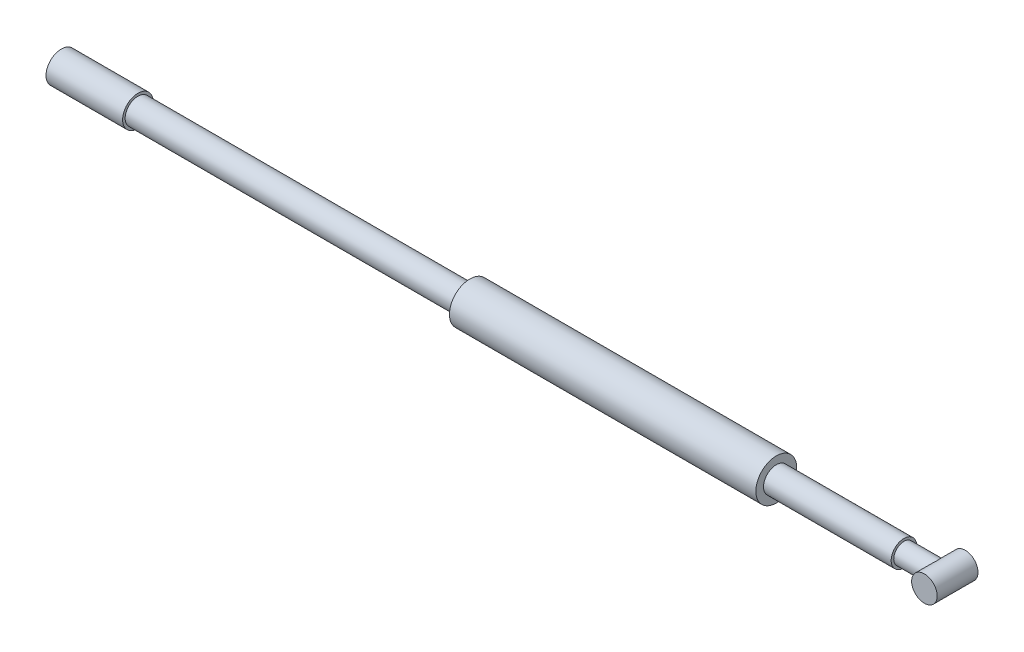
ISO-10303-21;
HEADER;
FILE_DESCRIPTION(('STEP AP214'),'2;1');
FILE_NAME('part.step','',(''),(''),'','','');
FILE_SCHEMA(('AUTOMOTIVE_DESIGN { 1 0 10303 214 1 1 1 1 }'));
ENDSEC;
DATA;
#1=APPLICATION_CONTEXT('core data for automotive mechanical design processes');
#2=APPLICATION_PROTOCOL_DEFINITION('international standard','automotive_design',2000,#1);
#3=PRODUCT_CONTEXT('',#1,'mechanical');
#4=PRODUCT('Part','Part','',(#3));
#5=PRODUCT_RELATED_PRODUCT_CATEGORY('part','',(#4));
#6=PRODUCT_DEFINITION_FORMATION('','',#4);
#7=PRODUCT_DEFINITION_CONTEXT('part definition',#1,'design');
#8=PRODUCT_DEFINITION('design','',#6,#7);
#9=PRODUCT_DEFINITION_SHAPE('','',#8);
#10=(LENGTH_UNIT() NAMED_UNIT(*) SI_UNIT(.MILLI.,.METRE.));
#11=(NAMED_UNIT(*) PLANE_ANGLE_UNIT() SI_UNIT($,.RADIAN.));
#12=(NAMED_UNIT(*) SI_UNIT($,.STERADIAN.) SOLID_ANGLE_UNIT());
#13=UNCERTAINTY_MEASURE_WITH_UNIT(LENGTH_MEASURE(1.E-05),#10,'distance_accuracy_value','');
#14=(GEOMETRIC_REPRESENTATION_CONTEXT(3) GLOBAL_UNCERTAINTY_ASSIGNED_CONTEXT((#13)) GLOBAL_UNIT_ASSIGNED_CONTEXT((#10,
#11,#12)) REPRESENTATION_CONTEXT('',''));
#15=CARTESIAN_POINT('',(0.,0.,0.));
#16=DIRECTION('',(0.,0.,1.));
#17=DIRECTION('',(1.,0.,0.));
#18=AXIS2_PLACEMENT_3D('',#15,#16,#17);
#19=CARTESIAN_POINT('',(150.,0.,0.));
#20=DIRECTION('',(1.,0.,0.));
#21=DIRECTION('',(0.,0.,-1.));
#22=AXIS2_PLACEMENT_3D('',#19,#20,#21);
#23=PLANE('',#22);
#24=CARTESIAN_POINT('',(150.,0.,0.));
#25=DIRECTION('',(1.,0.,0.));
#26=DIRECTION('',(0.,0.,-1.));
#27=AXIS2_PLACEMENT_3D('',#24,#25,#26);
#28=CIRCLE('',#27,2.5);
#29=CARTESIAN_POINT('',(150.,0.,-2.5));
#30=VERTEX_POINT('',#29);
#31=EDGE_CURVE('E40',#30,#30,#28,.T.);
#32=ORIENTED_EDGE('',*,*,#31,.T.);
#33=EDGE_LOOP('',(#32));
#34=FACE_BOUND('',#33,.T.);
#35=CARTESIAN_POINT('',(150.,0.,0.));
#36=DIRECTION('',(1.,0.,0.));
#37=DIRECTION('',(0.,0.,-1.));
#38=AXIS2_PLACEMENT_3D('',#35,#36,#37);
#39=CIRCLE('',#38,2.);
#40=CARTESIAN_POINT('',(150.,0.,-2.));
#41=VERTEX_POINT('',#40);
#42=EDGE_CURVE('E59',#41,#41,#39,.T.);
#43=ORIENTED_EDGE('',*,*,#42,.F.);
#44=EDGE_LOOP('',(#43));
#45=FACE_BOUND('',#44,.T.);
#46=ADVANCED_FACE('F33',(#34,#45),#23,.T.);
#47=CARTESIAN_POINT('',(150.,0.,0.));
#48=DIRECTION('',(-1.,0.,0.));
#49=DIRECTION('',(0.,0.,1.));
#50=AXIS2_PLACEMENT_3D('',#47,#48,#49);
#51=CYLINDRICAL_SURFACE('',#50,2.5);
#52=CARTESIAN_POINT('',(125.,0.,0.));
#53=DIRECTION('',(1.,0.,0.));
#54=DIRECTION('',(0.,0.,-1.));
#55=AXIS2_PLACEMENT_3D('',#52,#53,#54);
#56=CIRCLE('',#55,2.5);
#57=CARTESIAN_POINT('',(125.,0.,-2.5));
#58=VERTEX_POINT('',#57);
#59=EDGE_CURVE('E61',#58,#58,#56,.T.);
#60=ORIENTED_EDGE('',*,*,#59,.T.);
#61=EDGE_LOOP('',(#60));
#62=FACE_BOUND('',#61,.T.);
#63=ORIENTED_EDGE('',*,*,#31,.F.);
#64=EDGE_LOOP('',(#63));
#65=FACE_BOUND('',#64,.T.);
#66=ADVANCED_FACE('F35',(#62,#65),#51,.T.);
#67=CARTESIAN_POINT('',(158.,0.,0.));
#68=DIRECTION('',(-1.,0.,0.));
#69=DIRECTION('',(0.,0.,1.));
#70=AXIS2_PLACEMENT_3D('',#67,#68,#69);
#71=CYLINDRICAL_SURFACE('',#70,2.);
#72=CARTESIAN_POINT('',(155.5,0.,2.));
#73=CARTESIAN_POINT('',(155.500007350526,0.0959968964388697,1.99999242056707));
#74=CARTESIAN_POINT('',(155.505586315881,0.192133192964674,1.99303057133644));
#75=CARTESIAN_POINT('',(155.527407306394,0.381319365477408,1.96565005995827));
#76=CARTESIAN_POINT('',(155.543672919996,0.474361934321337,1.94520162873807));
#77=CARTESIAN_POINT('',(155.585332781848,0.65409491682451,1.89232172110493));
#78=CARTESIAN_POINT('',(155.610668798558,0.740821698128053,1.85996664856862));
#79=CARTESIAN_POINT('',(155.668639890034,0.906926323692547,1.78488265652265));
#80=CARTESIAN_POINT('',(155.701274987922,0.986304144671505,1.74215370414941));
#81=CARTESIAN_POINT('',(155.78424335271,1.16318123656702,1.63137163496894));
#82=CARTESIAN_POINT('',(155.836782513968,1.25736767952115,1.55968108482594));
#83=CARTESIAN_POINT('',(155.94707807397,1.43041367827883,1.4027219342605));
#84=CARTESIAN_POINT('',(156.004849277995,1.50922761533154,1.31741424649663));
#85=CARTESIAN_POINT('',(156.121439983702,1.6521591895554,1.13322601592733));
#86=CARTESIAN_POINT('',(156.18026169098,1.71602638457221,1.03415322702389));
#87=CARTESIAN_POINT('',(156.29117890117,1.82646834413603,0.823461217495821));
#88=CARTESIAN_POINT('',(156.343296529108,1.87310099386401,0.711885666112015));
#89=CARTESIAN_POINT('',(156.411643476991,1.93086043771818,0.526121048323026));
#90=CARTESIAN_POINT('',(156.433712722298,1.94865475820658,0.456188262019716));
#91=CARTESIAN_POINT('',(156.469301108442,1.9767339679833,0.312787315879543));
#92=CARTESIAN_POINT('',(156.482841258203,1.98703731881776,0.239328326475015));
#93=CARTESIAN_POINT('',(156.499157659389,1.99939840142554,0.0898074811289742));
#94=CARTESIAN_POINT('',(156.501839030734,2.00138345613423,0.013728515179218));
#95=CARTESIAN_POINT('',(156.495600376972,1.99669481699686,-0.13770489203273));
#96=CARTESIAN_POINT('',(156.486670533398,1.99001379511087,-0.213058665766282));
#97=CARTESIAN_POINT('',(156.456792787,1.9669530271194,-0.372222302612713));
#98=CARTESIAN_POINT('',(156.434181579505,1.94921808205622,-0.455508006053986));
#99=CARTESIAN_POINT('',(156.380025400637,1.90444547348849,-0.616535559537018));
#100=CARTESIAN_POINT('',(156.348454018014,1.87738025642252,-0.694260156539804));
#101=CARTESIAN_POINT('',(156.263438838406,1.79974102194078,-0.88066210604096));
#102=CARTESIAN_POINT('',(156.206866270318,1.74414886595504,-0.985802698304172));
#103=CARTESIAN_POINT('',(156.090862199393,1.61638467497538,-1.18371667779932));
#104=CARTESIAN_POINT('',(156.031426629511,1.54418846902466,-1.27647172084351));
#105=CARTESIAN_POINT('',(155.913872480316,1.38145818326399,-1.45127477140505));
#106=CARTESIAN_POINT('',(155.855831107392,1.2904870102697,-1.53297192230575));
#107=CARTESIAN_POINT('',(155.74828128505,1.0919849107267,-1.68009949943429));
#108=CARTESIAN_POINT('',(155.698750081776,0.98449964520111,-1.74557351611721));
#109=CARTESIAN_POINT('',(155.625754143567,0.787777814380592,-1.84056284740988));
#110=CARTESIAN_POINT('',(155.598889287758,0.70217772732924,-1.87500450443906));
#111=CARTESIAN_POINT('',(155.554024358886,0.524913923737187,-1.93212645098796));
#112=CARTESIAN_POINT('',(155.536017605031,0.43325483627232,-1.95481560494547));
#113=CARTESIAN_POINT('',(155.510296643148,0.245713233844962,-1.98713854693578));
#114=CARTESIAN_POINT('',(155.502636213663,0.14981130721265,-1.99670412474495));
#115=CARTESIAN_POINT('',(155.498513172981,-0.0426080028674871,-2.00185904897629));
#116=CARTESIAN_POINT('',(155.502048475909,-0.139125268327933,-1.99745099882206));
#117=CARTESIAN_POINT('',(155.519231413571,-0.321746674155435,-1.97591718375232));
#118=CARTESIAN_POINT('',(155.532036475949,-0.408060891756539,-1.95985082486099));
#119=CARTESIAN_POINT('',(155.565824867865,-0.576335674228695,-1.91712781889845));
#120=CARTESIAN_POINT('',(155.586810624466,-0.658294938856913,-1.89046802890339));
#121=CARTESIAN_POINT('',(155.637101505687,-0.821235877548883,-1.82584962821608));
#122=CARTESIAN_POINT('',(155.666840872631,-0.90184361941903,-1.78729421404365));
#123=CARTESIAN_POINT('',(155.732163772779,-1.05541000448329,-1.70113784836722));
#124=CARTESIAN_POINT('',(155.767747597416,-1.12836826593786,-1.65353644576547));
#125=CARTESIAN_POINT('',(155.850063124776,-1.27925237569141,-1.54077568170314));
#126=CARTESIAN_POINT('',(155.897630302318,-1.35550718978127,-1.47399830951702));
#127=CARTESIAN_POINT('',(155.99556502048,-1.49653687597528,-1.33061303862903));
#128=CARTESIAN_POINT('',(156.045940290089,-1.56127777727365,-1.25397716316119));
#129=CARTESIAN_POINT('',(156.126258646829,-1.65568487930785,-1.12356555676344));
#130=CARTESIAN_POINT('',(156.156452563145,-1.6891374179265,-1.07263940924669));
#131=CARTESIAN_POINT('',(156.215645844789,-1.75155001920542,-0.967377738576433));
#132=CARTESIAN_POINT('',(156.244644570481,-1.78050769868974,-0.913040428119234));
#133=CARTESIAN_POINT('',(156.30016171207,-1.83358089959816,-0.80112515971837));
#134=CARTESIAN_POINT('',(156.326689092252,-1.85771431687653,-0.743560232756344));
#135=CARTESIAN_POINT('',(156.375897901323,-1.90088481958634,-0.624991021496049));
#136=CARTESIAN_POINT('',(156.398582106196,-1.91992558931549,-0.563989262480495));
#137=CARTESIAN_POINT('',(156.439805797774,-1.95360165889082,-0.433913275762237));
#138=CARTESIAN_POINT('',(156.457902832852,-1.96779559724998,-0.364577335059687));
#139=CARTESIAN_POINT('',(156.485066284062,-1.98878905619367,-0.223162387261984));
#140=CARTESIAN_POINT('',(156.494155476925,-1.99560723074758,-0.15109077954955));
#141=CARTESIAN_POINT('',(156.501752632203,-2.00132058716546,-0.00565129453595544));
#142=CARTESIAN_POINT('',(156.500203740816,-2.0001731977979,0.0677214541541259));
#143=CARTESIAN_POINT('',(156.48669228304,-1.98996519544204,0.212984193023074));
#144=CARTESIAN_POINT('',(156.474713206526,-1.98089203653787,0.284871647326077));
#145=CARTESIAN_POINT('',(156.437929232439,-1.95207745752715,0.444606774344535));
#146=CARTESIAN_POINT('',(156.410507415806,-1.93009230408643,0.531423082491099));
#147=CARTESIAN_POINT('',(156.347110923576,-1.87608177217432,0.698633478689613));
#148=CARTESIAN_POINT('',(156.311111127887,-1.84402681542565,0.779007760036693));
#149=CARTESIAN_POINT('',(156.245088412756,-1.78094746311469,0.91217772204613));
#150=CARTESIAN_POINT('',(156.21611092675,-1.75202363190411,0.966519181518268));
#151=CARTESIAN_POINT('',(156.15692051261,-1.68964733782464,1.07183822981724));
#152=CARTESIAN_POINT('',(156.126707137885,-1.65619322765904,1.12281458495113));
#153=CARTESIAN_POINT('',(156.035620022419,-1.54918435570712,1.27077940329881));
#154=CARTESIAN_POINT('',(155.974301915186,-1.46898541640511,1.36279868666246));
#155=CARTESIAN_POINT('',(155.855817212129,-1.29001718858433,1.53338946483074));
#156=CARTESIAN_POINT('',(155.798715080359,-1.19101966157651,1.61177022423677));
#157=CARTESIAN_POINT('',(155.721253491955,-1.02998399899549,1.71557672941678));
#158=CARTESIAN_POINT('',(155.696811318907,-0.974255400199719,1.74786844413511));
#159=CARTESIAN_POINT('',(155.651338845344,-0.858854828628068,1.80736810096137));
#160=CARTESIAN_POINT('',(155.630306457711,-0.799185299805386,1.8345791544845));
#161=CARTESIAN_POINT('',(155.585790944885,-0.65503773942427,1.8917800598956));
#162=CARTESIAN_POINT('',(155.563971071124,-0.569110239590142,1.91948267180092));
#163=CARTESIAN_POINT('',(155.529411350232,-0.392713097427747,1.9631576733877));
#164=CARTESIAN_POINT('',(155.516647721831,-0.302256024103166,1.97916078877459));
#165=CARTESIAN_POINT('',(155.505946216909,-0.175880930919938,1.9925630255603));
#166=CARTESIAN_POINT('',(155.503720812366,-0.140808552821293,1.99534737874577));
#167=CARTESIAN_POINT('',(155.500746189821,-0.0704970748918385,1.99906746352746));
#168=CARTESIAN_POINT('',(155.499997300284,-0.0352579397117394,2.00000278378988));
#169=CARTESIAN_POINT('',(155.5,0.,2.));
#170=B_SPLINE_CURVE_WITH_KNOTS('',3,(#72,#73,#74,#75,#76,#77,#78,#79,#80,#81,#82,#83,#84,#85,
#86,#87,#88,#89,#90,#91,#92,#93,#94,#95,#96,#97,#98,#99,#100,#101,#102,#103,#104,#105,#106,#107,
#108,#109,#110,#111,#112,#113,#114,#115,#116,#117,#118,#119,#120,#121,#122,#123,#124,#125,#126,
#127,#128,#129,#130,#131,#132,#133,#134,#135,#136,#137,#138,#139,#140,#141,#142,#143,#144,#145,
#146,#147,#148,#149,#150,#151,#152,#153,#154,#155,#156,#157,#158,#159,#160,#161,#162,#163,#164,
#165,#166,#167,#168,#169),.UNSPECIFIED.,.T.,.F.,(4,2,2,2,2,2,2,2,2,2,2,2,2,2,2,2,2,2,2,2,2,2,2,
2,2,2,2,2,2,2,2,2,2,2,2,2,2,2,2,2,2,2,2,2,2,2,2,2,4),(0.,0.287836605992211,0.576310692639342,
0.862965057250612,1.14962032997081,1.536078882001,1.92366738187851,2.3173474176548,
2.70969292925126,2.93534486341129,3.16043877408109,3.38749528500758,3.61474392028822,
3.87758630032009,4.14121163495704,4.53425748188299,4.9278791588667,5.33198173288415,
5.73498644040672,6.02213978124799,6.30907621738864,6.59749843639961,6.88586692268769,
7.15087004938156,7.4159518575957,7.69742753051563,7.97891724351347,8.31365537249323,
8.64936529970899,8.85316560745903,9.05707360380847,9.26021055202075,9.46320013996577,
9.68152133432593,9.89928907450681,10.1182215471167,10.3375012031536,10.616933053181,
10.8971934831173,11.1010640012511,11.3050088506911,11.7129165318148,12.1261363563906,
12.3324811048119,12.5386990694968,12.8161540735934,13.0928777702216,13.1985714874516,
13.3042887145431),.UNSPECIFIED.);
#171=CARTESIAN_POINT('',(155.5,0.,2.));
#172=VERTEX_POINT('',#171);
#173=EDGE_CURVE('E53',#172,#172,#170,.T.);
#174=ORIENTED_EDGE('',*,*,#173,.T.);
#175=EDGE_LOOP('',(#174));
#176=FACE_BOUND('',#175,.T.);
#177=ORIENTED_EDGE('',*,*,#42,.T.);
#178=EDGE_LOOP('',(#177));
#179=FACE_BOUND('',#178,.T.);
#180=ADVANCED_FACE('F62',(#176,#179),#71,.T.);
#181=CARTESIAN_POINT('',(158.,0.,-4.));
#182=DIRECTION('',(0.,0.,1.));
#183=DIRECTION('',(1.,0.,0.));
#184=AXIS2_PLACEMENT_3D('',#181,#182,#183);
#185=CYLINDRICAL_SURFACE('',#184,2.5);
#186=CARTESIAN_POINT('',(158.,0.,4.));
#187=DIRECTION('',(0.,0.,1.));
#188=DIRECTION('',(1.,0.,0.));
#189=AXIS2_PLACEMENT_3D('',#186,#187,#188);
#190=CIRCLE('',#189,2.5);
#191=CARTESIAN_POINT('',(160.5,0.,4.));
#192=VERTEX_POINT('',#191);
#193=EDGE_CURVE('E129',#192,#192,#190,.T.);
#194=ORIENTED_EDGE('',*,*,#193,.F.);
#195=EDGE_LOOP('',(#194));
#196=FACE_BOUND('',#195,.T.);
#197=CARTESIAN_POINT('',(158.,0.,-4.));
#198=DIRECTION('',(0.,0.,1.));
#199=DIRECTION('',(1.,0.,0.));
#200=AXIS2_PLACEMENT_3D('',#197,#198,#199);
#201=CIRCLE('',#200,2.5);
#202=CARTESIAN_POINT('',(160.5,0.,-4.));
#203=VERTEX_POINT('',#202);
#204=EDGE_CURVE('E60',#203,#203,#201,.T.);
#205=ORIENTED_EDGE('',*,*,#204,.T.);
#206=EDGE_LOOP('',(#205));
#207=FACE_BOUND('',#206,.T.);
#208=ORIENTED_EDGE('',*,*,#173,.F.);
#209=EDGE_LOOP('',(#208));
#210=FACE_BOUND('',#209,.T.);
#211=ADVANCED_FACE('F65',(#196,#207,#210),#185,.T.);
#212=CARTESIAN_POINT('',(158.,0.,-4.));
#213=DIRECTION('',(0.,0.,1.));
#214=DIRECTION('',(1.,0.,0.));
#215=AXIS2_PLACEMENT_3D('',#212,#213,#214);
#216=PLANE('',#215);
#217=ORIENTED_EDGE('',*,*,#204,.F.);
#218=EDGE_LOOP('',(#217));
#219=FACE_BOUND('',#218,.T.);
#220=ADVANCED_FACE('F69',(#219),#216,.F.);
#221=CARTESIAN_POINT('',(158.,0.,4.));
#222=DIRECTION('',(0.,0.,1.));
#223=DIRECTION('',(1.,0.,0.));
#224=AXIS2_PLACEMENT_3D('',#221,#222,#223);
#225=PLANE('',#224);
#226=ORIENTED_EDGE('',*,*,#193,.T.);
#227=EDGE_LOOP('',(#226));
#228=FACE_BOUND('',#227,.T.);
#229=ADVANCED_FACE('F73',(#228),#225,.T.);
#230=CARTESIAN_POINT('',(65.,0.,0.));
#231=DIRECTION('',(1.,0.,0.));
#232=DIRECTION('',(0.,0.,-1.));
#233=AXIS2_PLACEMENT_3D('',#230,#231,#232);
#234=PLANE('',#233);
#235=CARTESIAN_POINT('',(65.,0.,0.));
#236=DIRECTION('',(-1.,0.,0.));
#237=DIRECTION('',(0.,0.,1.));
#238=AXIS2_PLACEMENT_3D('',#235,#236,#237);
#239=CIRCLE('',#238,4.);
#240=CARTESIAN_POINT('',(65.,0.,4.));
#241=VERTEX_POINT('',#240);
#242=EDGE_CURVE('E135',#241,#241,#239,.T.);
#243=ORIENTED_EDGE('',*,*,#242,.T.);
#244=EDGE_LOOP('',(#243));
#245=FACE_BOUND('',#244,.T.);
#246=CARTESIAN_POINT('',(65.,0.,0.));
#247=DIRECTION('',(1.,0.,0.));
#248=DIRECTION('',(0.,0.,-1.));
#249=AXIS2_PLACEMENT_3D('',#246,#247,#248);
#250=CIRCLE('',#249,2.5);
#251=CARTESIAN_POINT('',(65.,0.,-2.5));
#252=VERTEX_POINT('',#251);
#253=EDGE_CURVE('E11',#252,#252,#250,.T.);
#254=ORIENTED_EDGE('',*,*,#253,.T.);
#255=EDGE_LOOP('',(#254));
#256=FACE_BOUND('',#255,.T.);
#257=ADVANCED_FACE('F77',(#245,#256),#234,.F.);
#258=CARTESIAN_POINT('',(125.,0.,0.));
#259=DIRECTION('',(1.,0.,0.));
#260=DIRECTION('',(0.,0.,-1.));
#261=AXIS2_PLACEMENT_3D('',#258,#259,#260);
#262=PLANE('',#261);
#263=CARTESIAN_POINT('',(125.,0.,0.));
#264=DIRECTION('',(-1.,0.,0.));
#265=DIRECTION('',(0.,0.,1.));
#266=AXIS2_PLACEMENT_3D('',#263,#264,#265);
#267=CIRCLE('',#266,4.);
#268=CARTESIAN_POINT('',(125.,0.,4.));
#269=VERTEX_POINT('',#268);
#270=EDGE_CURVE('E132',#269,#269,#267,.T.);
#271=ORIENTED_EDGE('',*,*,#270,.F.);
#272=EDGE_LOOP('',(#271));
#273=FACE_BOUND('',#272,.T.);
#274=ORIENTED_EDGE('',*,*,#59,.F.);
#275=EDGE_LOOP('',(#274));
#276=FACE_BOUND('',#275,.T.);
#277=ADVANCED_FACE('F81',(#273,#276),#262,.T.);
#278=CARTESIAN_POINT('',(65.,0.,0.));
#279=DIRECTION('',(1.,0.,0.));
#280=DIRECTION('',(0.,0.,-1.));
#281=AXIS2_PLACEMENT_3D('',#278,#279,#280);
#282=CYLINDRICAL_SURFACE('',#281,4.);
#283=ORIENTED_EDGE('',*,*,#242,.F.);
#284=EDGE_LOOP('',(#283));
#285=FACE_BOUND('',#284,.T.);
#286=ORIENTED_EDGE('',*,*,#270,.T.);
#287=EDGE_LOOP('',(#286));
#288=FACE_BOUND('',#287,.T.);
#289=ADVANCED_FACE('F85',(#285,#288),#282,.T.);
#290=CARTESIAN_POINT('',(-15.,0.,0.));
#291=DIRECTION('',(-1.,0.,0.));
#292=DIRECTION('',(0.,0.,1.));
#293=AXIS2_PLACEMENT_3D('',#290,#291,#292);
#294=PLANE('',#293);
#295=CARTESIAN_POINT('',(-15.,0.,0.));
#296=DIRECTION('',(-1.,0.,0.));
#297=DIRECTION('',(0.,0.,1.));
#298=AXIS2_PLACEMENT_3D('',#295,#296,#297);
#299=CIRCLE('',#298,3.);
#300=CARTESIAN_POINT('',(-15.,0.,3.));
#301=VERTEX_POINT('',#300);
#302=EDGE_CURVE('E49',#301,#301,#299,.T.);
#303=ORIENTED_EDGE('',*,*,#302,.T.);
#304=EDGE_LOOP('',(#303));
#305=FACE_BOUND('',#304,.T.);
#306=ADVANCED_FACE('F88',(#305),#294,.T.);
#307=CARTESIAN_POINT('',(-15.,0.,0.));
#308=DIRECTION('',(1.,0.,0.));
#309=DIRECTION('',(0.,0.,-1.));
#310=AXIS2_PLACEMENT_3D('',#307,#308,#309);
#311=CYLINDRICAL_SURFACE('',#310,3.);
#312=ORIENTED_EDGE('',*,*,#302,.F.);
#313=EDGE_LOOP('',(#312));
#314=FACE_BOUND('',#313,.T.);
#315=CARTESIAN_POINT('',(0.,0.,0.));
#316=DIRECTION('',(-1.,0.,0.));
#317=DIRECTION('',(0.,0.,1.));
#318=AXIS2_PLACEMENT_3D('',#315,#316,#317);
#319=CIRCLE('',#318,3.);
#320=CARTESIAN_POINT('',(0.,0.,3.));
#321=VERTEX_POINT('',#320);
#322=EDGE_CURVE('E118',#321,#321,#319,.T.);
#323=ORIENTED_EDGE('',*,*,#322,.T.);
#324=EDGE_LOOP('',(#323));
#325=FACE_BOUND('',#324,.T.);
#326=ADVANCED_FACE('F93',(#314,#325),#311,.T.);
#327=CARTESIAN_POINT('',(0.,0.,0.));
#328=DIRECTION('',(-1.,0.,0.));
#329=DIRECTION('',(0.,0.,1.));
#330=AXIS2_PLACEMENT_3D('',#327,#328,#329);
#331=PLANE('',#330);
#332=ORIENTED_EDGE('',*,*,#322,.F.);
#333=EDGE_LOOP('',(#332));
#334=FACE_BOUND('',#333,.T.);
#335=CARTESIAN_POINT('',(0.,0.,0.));
#336=DIRECTION('',(-1.,0.,0.));
#337=DIRECTION('',(0.,0.,1.));
#338=AXIS2_PLACEMENT_3D('',#335,#336,#337);
#339=CIRCLE('',#338,2.5);
#340=CARTESIAN_POINT('',(0.,0.,2.5));
#341=VERTEX_POINT('',#340);
#342=EDGE_CURVE('E44',#341,#341,#339,.T.);
#343=ORIENTED_EDGE('',*,*,#342,.T.);
#344=EDGE_LOOP('',(#343));
#345=FACE_BOUND('',#344,.T.);
#346=ADVANCED_FACE('F107',(#334,#345),#331,.F.);
#347=ORIENTED_EDGE('',*,*,#342,.F.);
#348=EDGE_LOOP('',(#347));
#349=FACE_BOUND('',#348,.T.);
#350=ORIENTED_EDGE('',*,*,#253,.F.);
#351=EDGE_LOOP('',(#350));
#352=FACE_BOUND('',#351,.T.);
#353=ADVANCED_FACE('F102',(#349,#352),#51,.T.);
#354=CLOSED_SHELL('',(#46,#66,#180,#211,#220,#229,#257,#277,#289,#306,#326,#346,#353));
#355=MANIFOLD_SOLID_BREP('B2',#354);
#356=ADVANCED_BREP_SHAPE_REPRESENTATION('',(#18,#355),#14);
#357=SHAPE_DEFINITION_REPRESENTATION(#9,#356);
ENDSEC;
END-ISO-10303-21;
